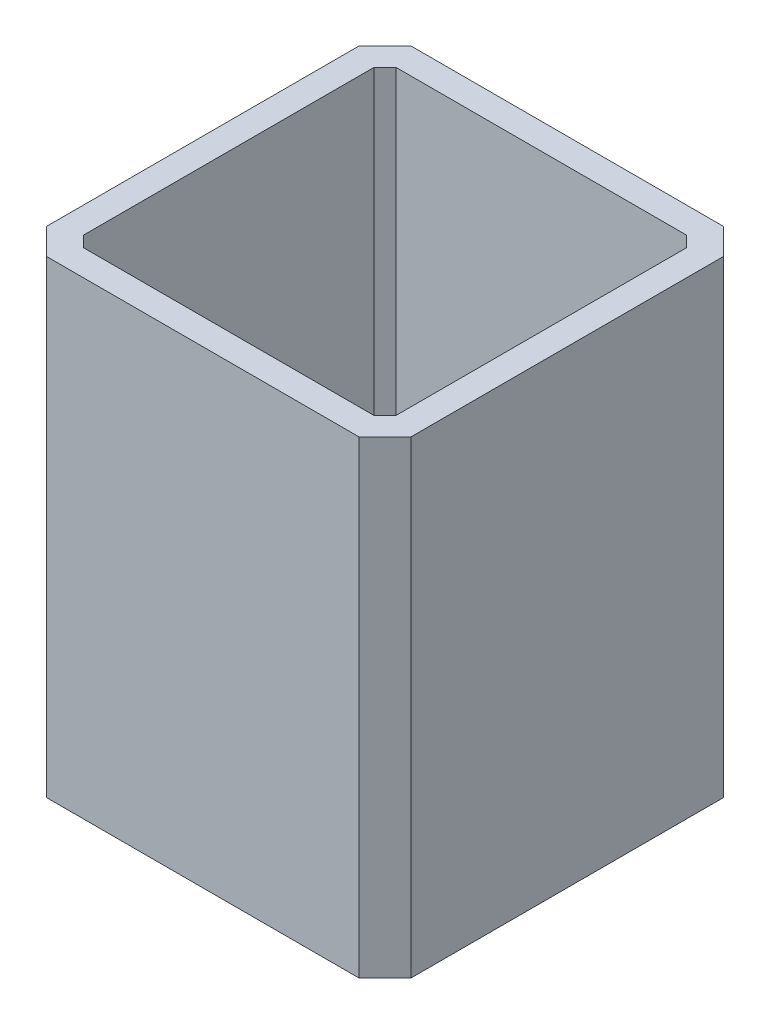
ISO-10303-21;
HEADER;
FILE_DESCRIPTION(('STEP AP214'),'2;1');
FILE_NAME('part.step','',(''),(''),'','','');
FILE_SCHEMA(('AUTOMOTIVE_DESIGN { 1 0 10303 214 1 1 1 1 }'));
ENDSEC;
DATA;
#1=APPLICATION_CONTEXT('core data for automotive mechanical design processes');
#2=APPLICATION_PROTOCOL_DEFINITION('international standard','automotive_design',2000,#1);
#3=PRODUCT_CONTEXT('',#1,'mechanical');
#4=PRODUCT('Part','Part','',(#3));
#5=PRODUCT_RELATED_PRODUCT_CATEGORY('part','',(#4));
#6=PRODUCT_DEFINITION_FORMATION('','',#4);
#7=PRODUCT_DEFINITION_CONTEXT('part definition',#1,'design');
#8=PRODUCT_DEFINITION('design','',#6,#7);
#9=PRODUCT_DEFINITION_SHAPE('','',#8);
#10=(LENGTH_UNIT() NAMED_UNIT(*) SI_UNIT(.MILLI.,.METRE.));
#11=(NAMED_UNIT(*) PLANE_ANGLE_UNIT() SI_UNIT($,.RADIAN.));
#12=(NAMED_UNIT(*) SI_UNIT($,.STERADIAN.) SOLID_ANGLE_UNIT());
#13=UNCERTAINTY_MEASURE_WITH_UNIT(LENGTH_MEASURE(1.E-05),#10,'distance_accuracy_value','');
#14=(GEOMETRIC_REPRESENTATION_CONTEXT(3) GLOBAL_UNCERTAINTY_ASSIGNED_CONTEXT((#13)) GLOBAL_UNIT_ASSIGNED_CONTEXT((#10,
#11,#12)) REPRESENTATION_CONTEXT('',''));
#15=CARTESIAN_POINT('',(0.,0.,0.));
#16=DIRECTION('',(0.,0.,1.));
#17=DIRECTION('',(1.,0.,0.));
#18=AXIS2_PLACEMENT_3D('',#15,#16,#17);
#19=CARTESIAN_POINT('',(1.,18.,-14.));
#20=DIRECTION('',(0.,0.,1.));
#21=DIRECTION('',(1.,0.,0.));
#22=AXIS2_PLACEMENT_3D('',#19,#20,#21);
#23=PLANE('',#22);
#24=DIRECTION('',(-1.,0.,0.));
#25=VECTOR('',#24,1.);
#26=CARTESIAN_POINT('',(1.,0.,-14.));
#27=LINE('',#26,#25);
#28=CARTESIAN_POINT('',(13.,0.,-14.));
#29=VERTEX_POINT('',#28);
#30=CARTESIAN_POINT('',(1.,0.,-14.));
#31=VERTEX_POINT('',#30);
#32=EDGE_CURVE('E142',#29,#31,#27,.T.);
#33=ORIENTED_EDGE('',*,*,#32,.T.);
#34=DIRECTION('',(0.,-1.,0.));
#35=VECTOR('',#34,1.);
#36=CARTESIAN_POINT('',(1.,18.,-14.));
#37=LINE('',#36,#35);
#38=CARTESIAN_POINT('',(1.,18.,-14.));
#39=VERTEX_POINT('',#38);
#40=EDGE_CURVE('E11',#39,#31,#37,.T.);
#41=ORIENTED_EDGE('',*,*,#40,.F.);
#42=DIRECTION('',(-1.,0.,0.));
#43=VECTOR('',#42,1.);
#44=CARTESIAN_POINT('',(1.,18.,-14.));
#45=LINE('',#44,#43);
#46=CARTESIAN_POINT('',(13.,18.,-14.));
#47=VERTEX_POINT('',#46);
#48=EDGE_CURVE('E158',#47,#39,#45,.T.);
#49=ORIENTED_EDGE('',*,*,#48,.F.);
#50=DIRECTION('',(0.,-1.,0.));
#51=VECTOR('',#50,1.);
#52=CARTESIAN_POINT('',(13.,18.,-14.));
#53=LINE('',#52,#51);
#54=EDGE_CURVE('E138',#47,#29,#53,.T.);
#55=ORIENTED_EDGE('',*,*,#54,.T.);
#56=EDGE_LOOP('',(#33,#41,#49,#55));
#57=FACE_BOUND('',#56,.T.);
#58=ADVANCED_FACE('F35',(#57),#23,.F.);
#59=CARTESIAN_POINT('',(0.,18.,-13.));
#60=DIRECTION('',(0.707106781186547,0.,0.707106781186548));
#61=DIRECTION('',(0.707106781186548,0.,-0.707106781186547));
#62=AXIS2_PLACEMENT_3D('',#59,#60,#61);
#63=PLANE('',#62);
#64=DIRECTION('',(-0.707106781186548,0.,0.707106781186547));
#65=VECTOR('',#64,1.);
#66=CARTESIAN_POINT('',(0.,0.,-13.));
#67=LINE('',#66,#65);
#68=CARTESIAN_POINT('',(0.,0.,-13.));
#69=VERTEX_POINT('',#68);
#70=EDGE_CURVE('E145',#31,#69,#67,.T.);
#71=ORIENTED_EDGE('',*,*,#70,.T.);
#72=DIRECTION('',(0.,-1.,0.));
#73=VECTOR('',#72,1.);
#74=CARTESIAN_POINT('',(0.,18.,-13.));
#75=LINE('',#74,#73);
#76=CARTESIAN_POINT('',(0.,18.,-13.));
#77=VERTEX_POINT('',#76);
#78=EDGE_CURVE('E42',#77,#69,#75,.T.);
#79=ORIENTED_EDGE('',*,*,#78,.F.);
#80=DIRECTION('',(-0.707106781186548,0.,0.707106781186547));
#81=VECTOR('',#80,1.);
#82=CARTESIAN_POINT('',(0.,18.,-13.));
#83=LINE('',#82,#81);
#84=EDGE_CURVE('E99',#39,#77,#83,.T.);
#85=ORIENTED_EDGE('',*,*,#84,.F.);
#86=ORIENTED_EDGE('',*,*,#40,.T.);
#87=EDGE_LOOP('',(#71,#79,#85,#86));
#88=FACE_BOUND('',#87,.T.);
#89=ADVANCED_FACE('F327',(#88),#63,.F.);
#90=CARTESIAN_POINT('',(0.,18.,-1.));
#91=DIRECTION('',(1.,0.,0.));
#92=DIRECTION('',(0.,0.,-1.));
#93=AXIS2_PLACEMENT_3D('',#90,#91,#92);
#94=PLANE('',#93);
#95=DIRECTION('',(0.,0.,1.));
#96=VECTOR('',#95,1.);
#97=CARTESIAN_POINT('',(0.,0.,-1.));
#98=LINE('',#97,#96);
#99=CARTESIAN_POINT('',(0.,0.,-1.));
#100=VERTEX_POINT('',#99);
#101=EDGE_CURVE('E148',#69,#100,#98,.T.);
#102=ORIENTED_EDGE('',*,*,#101,.T.);
#103=DIRECTION('',(0.,-1.,0.));
#104=VECTOR('',#103,1.);
#105=CARTESIAN_POINT('',(0.,18.,-1.));
#106=LINE('',#105,#104);
#107=CARTESIAN_POINT('',(0.,18.,-1.));
#108=VERTEX_POINT('',#107);
#109=EDGE_CURVE('E165',#108,#100,#106,.T.);
#110=ORIENTED_EDGE('',*,*,#109,.F.);
#111=DIRECTION('',(0.,0.,1.));
#112=VECTOR('',#111,1.);
#113=CARTESIAN_POINT('',(0.,18.,-1.));
#114=LINE('',#113,#112);
#115=EDGE_CURVE('E173',#77,#108,#114,.T.);
#116=ORIENTED_EDGE('',*,*,#115,.F.);
#117=ORIENTED_EDGE('',*,*,#78,.T.);
#118=EDGE_LOOP('',(#102,#110,#116,#117));
#119=FACE_BOUND('',#118,.T.);
#120=ADVANCED_FACE('F171',(#119),#94,.F.);
#121=CARTESIAN_POINT('',(1.,18.,0.));
#122=DIRECTION('',(0.707106781186547,0.,-0.707106781186547));
#123=DIRECTION('',(-0.707106781186548,0.,-0.707106781186548));
#124=AXIS2_PLACEMENT_3D('',#121,#122,#123);
#125=PLANE('',#124);
#126=DIRECTION('',(0.707106781186548,0.,0.707106781186548));
#127=VECTOR('',#126,1.);
#128=CARTESIAN_POINT('',(1.,0.,0.));
#129=LINE('',#128,#127);
#130=CARTESIAN_POINT('',(1.,0.,0.));
#131=VERTEX_POINT('',#130);
#132=EDGE_CURVE('E150',#100,#131,#129,.T.);
#133=ORIENTED_EDGE('',*,*,#132,.T.);
#134=DIRECTION('',(0.,-1.,0.));
#135=VECTOR('',#134,1.);
#136=CARTESIAN_POINT('',(1.,18.,0.));
#137=LINE('',#136,#135);
#138=CARTESIAN_POINT('',(1.,18.,0.));
#139=VERTEX_POINT('',#138);
#140=EDGE_CURVE('E162',#139,#131,#137,.T.);
#141=ORIENTED_EDGE('',*,*,#140,.F.);
#142=DIRECTION('',(0.707106781186548,0.,0.707106781186548));
#143=VECTOR('',#142,1.);
#144=CARTESIAN_POINT('',(1.,18.,0.));
#145=LINE('',#144,#143);
#146=EDGE_CURVE('E185',#108,#139,#145,.T.);
#147=ORIENTED_EDGE('',*,*,#146,.F.);
#148=ORIENTED_EDGE('',*,*,#109,.T.);
#149=EDGE_LOOP('',(#133,#141,#147,#148));
#150=FACE_BOUND('',#149,.T.);
#151=ADVANCED_FACE('F181',(#150),#125,.F.);
#152=CARTESIAN_POINT('',(1.,18.,0.));
#153=DIRECTION('',(0.,0.,-1.));
#154=DIRECTION('',(-1.,0.,0.));
#155=AXIS2_PLACEMENT_3D('',#152,#153,#154);
#156=PLANE('',#155);
#157=DIRECTION('',(1.,0.,0.));
#158=VECTOR('',#157,1.);
#159=CARTESIAN_POINT('',(1.,0.,0.));
#160=LINE('',#159,#158);
#161=CARTESIAN_POINT('',(13.,0.,0.));
#162=VERTEX_POINT('',#161);
#163=EDGE_CURVE('E152',#131,#162,#160,.T.);
#164=ORIENTED_EDGE('',*,*,#163,.T.);
#165=DIRECTION('',(0.,-1.,0.));
#166=VECTOR('',#165,1.);
#167=CARTESIAN_POINT('',(13.,18.,0.));
#168=LINE('',#167,#166);
#169=CARTESIAN_POINT('',(13.,18.,0.));
#170=VERTEX_POINT('',#169);
#171=EDGE_CURVE('E133',#170,#162,#168,.T.);
#172=ORIENTED_EDGE('',*,*,#171,.F.);
#173=DIRECTION('',(1.,0.,0.));
#174=VECTOR('',#173,1.);
#175=CARTESIAN_POINT('',(1.,18.,0.));
#176=LINE('',#175,#174);
#177=EDGE_CURVE('E121',#139,#170,#176,.T.);
#178=ORIENTED_EDGE('',*,*,#177,.F.);
#179=ORIENTED_EDGE('',*,*,#140,.T.);
#180=EDGE_LOOP('',(#164,#172,#178,#179));
#181=FACE_BOUND('',#180,.T.);
#182=ADVANCED_FACE('F184',(#181),#156,.F.);
#183=CARTESIAN_POINT('',(13.,18.,0.));
#184=DIRECTION('',(-0.707106781186548,0.,-0.707106781186547));
#185=DIRECTION('',(-0.707106781186547,0.,0.707106781186548));
#186=AXIS2_PLACEMENT_3D('',#183,#184,#185);
#187=PLANE('',#186);
#188=DIRECTION('',(0.707106781186547,0.,-0.707106781186548));
#189=VECTOR('',#188,1.);
#190=CARTESIAN_POINT('',(13.,0.,0.));
#191=LINE('',#190,#189);
#192=CARTESIAN_POINT('',(14.,0.,-1.));
#193=VERTEX_POINT('',#192);
#194=EDGE_CURVE('E130',#162,#193,#191,.T.);
#195=ORIENTED_EDGE('',*,*,#194,.T.);
#196=DIRECTION('',(0.,-1.,0.));
#197=VECTOR('',#196,1.);
#198=CARTESIAN_POINT('',(14.,18.,-1.));
#199=LINE('',#198,#197);
#200=CARTESIAN_POINT('',(14.,18.,-1.));
#201=VERTEX_POINT('',#200);
#202=EDGE_CURVE('E127',#201,#193,#199,.T.);
#203=ORIENTED_EDGE('',*,*,#202,.F.);
#204=DIRECTION('',(0.707106781186547,0.,-0.707106781186548));
#205=VECTOR('',#204,1.);
#206=CARTESIAN_POINT('',(13.,18.,0.));
#207=LINE('',#206,#205);
#208=EDGE_CURVE('E114',#170,#201,#207,.T.);
#209=ORIENTED_EDGE('',*,*,#208,.F.);
#210=ORIENTED_EDGE('',*,*,#171,.T.);
#211=EDGE_LOOP('',(#195,#203,#209,#210));
#212=FACE_BOUND('',#211,.T.);
#213=ADVANCED_FACE('F128',(#212),#187,.F.);
#214=CARTESIAN_POINT('',(14.,18.,-1.));
#215=DIRECTION('',(-1.,0.,0.));
#216=DIRECTION('',(0.,0.,1.));
#217=AXIS2_PLACEMENT_3D('',#214,#215,#216);
#218=PLANE('',#217);
#219=DIRECTION('',(0.,0.,-1.));
#220=VECTOR('',#219,1.);
#221=CARTESIAN_POINT('',(14.,0.,-1.));
#222=LINE('',#221,#220);
#223=CARTESIAN_POINT('',(14.,0.,-13.));
#224=VERTEX_POINT('',#223);
#225=EDGE_CURVE('E155',#193,#224,#222,.T.);
#226=ORIENTED_EDGE('',*,*,#225,.T.);
#227=DIRECTION('',(0.,-1.,0.));
#228=VECTOR('',#227,1.);
#229=CARTESIAN_POINT('',(14.,18.,-13.));
#230=LINE('',#229,#228);
#231=CARTESIAN_POINT('',(14.,18.,-13.));
#232=VERTEX_POINT('',#231);
#233=EDGE_CURVE('E134',#232,#224,#230,.T.);
#234=ORIENTED_EDGE('',*,*,#233,.F.);
#235=DIRECTION('',(0.,0.,-1.));
#236=VECTOR('',#235,1.);
#237=CARTESIAN_POINT('',(14.,18.,-1.));
#238=LINE('',#237,#236);
#239=EDGE_CURVE('E118',#201,#232,#238,.T.);
#240=ORIENTED_EDGE('',*,*,#239,.F.);
#241=ORIENTED_EDGE('',*,*,#202,.T.);
#242=EDGE_LOOP('',(#226,#234,#240,#241));
#243=FACE_BOUND('',#242,.T.);
#244=ADVANCED_FACE('F136',(#243),#218,.F.);
#245=CARTESIAN_POINT('',(13.,18.,-14.));
#246=DIRECTION('',(-0.707106781186547,0.,0.707106781186548));
#247=DIRECTION('',(0.707106781186548,0.,0.707106781186547));
#248=AXIS2_PLACEMENT_3D('',#245,#246,#247);
#249=PLANE('',#248);
#250=DIRECTION('',(-0.707106781186548,0.,-0.707106781186547));
#251=VECTOR('',#250,1.);
#252=CARTESIAN_POINT('',(13.,0.,-14.));
#253=LINE('',#252,#251);
#254=EDGE_CURVE('E91',#224,#29,#253,.T.);
#255=ORIENTED_EDGE('',*,*,#254,.T.);
#256=ORIENTED_EDGE('',*,*,#54,.F.);
#257=DIRECTION('',(-0.707106781186548,0.,-0.707106781186547));
#258=VECTOR('',#257,1.);
#259=CARTESIAN_POINT('',(13.,18.,-14.));
#260=LINE('',#259,#258);
#261=EDGE_CURVE('E58',#232,#47,#260,.T.);
#262=ORIENTED_EDGE('',*,*,#261,.F.);
#263=ORIENTED_EDGE('',*,*,#233,.T.);
#264=EDGE_LOOP('',(#255,#256,#262,#263));
#265=FACE_BOUND('',#264,.T.);
#266=ADVANCED_FACE('F334',(#265),#249,.F.);
#267=CARTESIAN_POINT('',(0.,18.,0.));
#268=DIRECTION('',(0.,1.,0.));
#269=DIRECTION('',(0.,0.,1.));
#270=AXIS2_PLACEMENT_3D('',#267,#268,#269);
#271=PLANE('',#270);
#272=DIRECTION('',(-1.,0.,0.));
#273=VECTOR('',#272,1.);
#274=CARTESIAN_POINT('',(1.,18.,-13.));
#275=LINE('',#274,#273);
#276=CARTESIAN_POINT('',(12.5857864376269,18.,-13.));
#277=VERTEX_POINT('',#276);
#278=CARTESIAN_POINT('',(1.4142135623731,18.,-13.));
#279=VERTEX_POINT('',#278);
#280=EDGE_CURVE('E211',#277,#279,#275,.T.);
#281=ORIENTED_EDGE('',*,*,#280,.F.);
#282=DIRECTION('',(-0.707106781186548,0.,-0.707106781186547));
#283=VECTOR('',#282,1.);
#284=CARTESIAN_POINT('',(12.2928932188135,18.,-13.2928932188135));
#285=LINE('',#284,#283);
#286=CARTESIAN_POINT('',(13.,18.,-12.5857864376269));
#287=VERTEX_POINT('',#286);
#288=EDGE_CURVE('E191',#287,#277,#285,.T.);
#289=ORIENTED_EDGE('',*,*,#288,.F.);
#290=DIRECTION('',(0.,0.,-1.));
#291=VECTOR('',#290,1.);
#292=CARTESIAN_POINT('',(13.,18.,-1.));
#293=LINE('',#292,#291);
#294=CARTESIAN_POINT('',(13.,18.,-1.4142135623731));
#295=VERTEX_POINT('',#294);
#296=EDGE_CURVE('E194',#295,#287,#293,.T.);
#297=ORIENTED_EDGE('',*,*,#296,.F.);
#298=DIRECTION('',(0.707106781186547,0.,-0.707106781186548));
#299=VECTOR('',#298,1.);
#300=CARTESIAN_POINT('',(12.2928932188135,18.,-0.707106781186547));
#301=LINE('',#300,#299);
#302=CARTESIAN_POINT('',(12.5857864376269,18.,-1.));
#303=VERTEX_POINT('',#302);
#304=EDGE_CURVE('E196',#303,#295,#301,.T.);
#305=ORIENTED_EDGE('',*,*,#304,.F.);
#306=DIRECTION('',(1.,0.,0.));
#307=VECTOR('',#306,1.);
#308=CARTESIAN_POINT('',(1.,18.,-1.));
#309=LINE('',#308,#307);
#310=CARTESIAN_POINT('',(1.4142135623731,18.,-1.));
#311=VERTEX_POINT('',#310);
#312=EDGE_CURVE('E199',#311,#303,#309,.T.);
#313=ORIENTED_EDGE('',*,*,#312,.F.);
#314=DIRECTION('',(0.707106781186548,0.,0.707106781186548));
#315=VECTOR('',#314,1.);
#316=CARTESIAN_POINT('',(1.70710678118655,18.,-0.707106781186547));
#317=LINE('',#316,#315);
#318=CARTESIAN_POINT('',(1.,18.,-1.41421356237309));
#319=VERTEX_POINT('',#318);
#320=EDGE_CURVE('E202',#319,#311,#317,.T.);
#321=ORIENTED_EDGE('',*,*,#320,.F.);
#322=DIRECTION('',(0.,0.,1.));
#323=VECTOR('',#322,1.);
#324=CARTESIAN_POINT('',(1.,18.,-1.));
#325=LINE('',#324,#323);
#326=CARTESIAN_POINT('',(1.,18.,-12.5857864376269));
#327=VERTEX_POINT('',#326);
#328=EDGE_CURVE('E205',#327,#319,#325,.T.);
#329=ORIENTED_EDGE('',*,*,#328,.F.);
#330=DIRECTION('',(-0.707106781186548,0.,0.707106781186547));
#331=VECTOR('',#330,1.);
#332=CARTESIAN_POINT('',(0.707106781186547,18.,-12.2928932188135));
#333=LINE('',#332,#331);
#334=EDGE_CURVE('E208',#279,#327,#333,.T.);
#335=ORIENTED_EDGE('',*,*,#334,.F.);
#336=EDGE_LOOP('',(#281,#289,#297,#305,#313,#321,#329,#335));
#337=FACE_BOUND('',#336,.T.);
#338=ORIENTED_EDGE('',*,*,#48,.T.);
#339=ORIENTED_EDGE('',*,*,#84,.T.);
#340=ORIENTED_EDGE('',*,*,#115,.T.);
#341=ORIENTED_EDGE('',*,*,#146,.T.);
#342=ORIENTED_EDGE('',*,*,#177,.T.);
#343=ORIENTED_EDGE('',*,*,#208,.T.);
#344=ORIENTED_EDGE('',*,*,#239,.T.);
#345=ORIENTED_EDGE('',*,*,#261,.T.);
#346=EDGE_LOOP('',(#338,#339,#340,#341,#342,#343,#344,#345));
#347=FACE_BOUND('',#346,.T.);
#348=ADVANCED_FACE('F116',(#337,#347),#271,.T.);
#349=CARTESIAN_POINT('',(0.,0.,0.));
#350=DIRECTION('',(0.,1.,0.));
#351=DIRECTION('',(0.,0.,1.));
#352=AXIS2_PLACEMENT_3D('',#349,#350,#351);
#353=PLANE('',#352);
#354=ORIENTED_EDGE('',*,*,#32,.F.);
#355=ORIENTED_EDGE('',*,*,#254,.F.);
#356=ORIENTED_EDGE('',*,*,#225,.F.);
#357=ORIENTED_EDGE('',*,*,#194,.F.);
#358=ORIENTED_EDGE('',*,*,#163,.F.);
#359=ORIENTED_EDGE('',*,*,#132,.F.);
#360=ORIENTED_EDGE('',*,*,#101,.F.);
#361=ORIENTED_EDGE('',*,*,#70,.F.);
#362=EDGE_LOOP('',(#354,#355,#356,#357,#358,#359,#360,#361));
#363=FACE_BOUND('',#362,.T.);
#364=ADVANCED_FACE('F177',(#363),#353,.F.);
#365=CARTESIAN_POINT('',(1.,18.,-13.));
#366=DIRECTION('',(0.,0.,1.));
#367=DIRECTION('',(1.,0.,0.));
#368=AXIS2_PLACEMENT_3D('',#365,#366,#367);
#369=PLANE('',#368);
#370=DIRECTION('',(-1.,0.,0.));
#371=VECTOR('',#370,1.);
#372=CARTESIAN_POINT('',(1.,1.,-13.));
#373=LINE('',#372,#371);
#374=CARTESIAN_POINT('',(12.5857864376269,1.,-13.));
#375=VERTEX_POINT('',#374);
#376=CARTESIAN_POINT('',(1.4142135623731,1.,-13.));
#377=VERTEX_POINT('',#376);
#378=EDGE_CURVE('E251',#375,#377,#373,.T.);
#379=ORIENTED_EDGE('',*,*,#378,.F.);
#380=DIRECTION('',(0.,-1.,0.));
#381=VECTOR('',#380,1.);
#382=CARTESIAN_POINT('',(12.5857864376269,18.,-13.));
#383=LINE('',#382,#381);
#384=EDGE_CURVE('E193',#277,#375,#383,.T.);
#385=ORIENTED_EDGE('',*,*,#384,.F.);
#386=ORIENTED_EDGE('',*,*,#280,.T.);
#387=DIRECTION('',(0.,-1.,0.));
#388=VECTOR('',#387,1.);
#389=CARTESIAN_POINT('',(1.4142135623731,18.,-13.));
#390=LINE('',#389,#388);
#391=EDGE_CURVE('E146',#279,#377,#390,.T.);
#392=ORIENTED_EDGE('',*,*,#391,.T.);
#393=EDGE_LOOP('',(#379,#385,#386,#392));
#394=FACE_BOUND('',#393,.T.);
#395=ADVANCED_FACE('F267',(#394),#369,.T.);
#396=CARTESIAN_POINT('',(0.707106781186547,18.,-12.2928932188135));
#397=DIRECTION('',(0.707106781186547,0.,0.707106781186548));
#398=DIRECTION('',(0.707106781186548,0.,-0.707106781186547));
#399=AXIS2_PLACEMENT_3D('',#396,#397,#398);
#400=PLANE('',#399);
#401=DIRECTION('',(-0.707106781186548,0.,0.707106781186547));
#402=VECTOR('',#401,1.);
#403=CARTESIAN_POINT('',(0.707106781186547,1.,-12.2928932188135));
#404=LINE('',#403,#402);
#405=CARTESIAN_POINT('',(1.,1.,-12.5857864376269));
#406=VERTEX_POINT('',#405);
#407=EDGE_CURVE('E246',#377,#406,#404,.T.);
#408=ORIENTED_EDGE('',*,*,#407,.F.);
#409=ORIENTED_EDGE('',*,*,#391,.F.);
#410=ORIENTED_EDGE('',*,*,#334,.T.);
#411=DIRECTION('',(0.,-1.,0.));
#412=VECTOR('',#411,1.);
#413=CARTESIAN_POINT('',(1.,18.,-12.5857864376269));
#414=LINE('',#413,#412);
#415=EDGE_CURVE('E243',#327,#406,#414,.T.);
#416=ORIENTED_EDGE('',*,*,#415,.T.);
#417=EDGE_LOOP('',(#408,#409,#410,#416));
#418=FACE_BOUND('',#417,.T.);
#419=ADVANCED_FACE('F297',(#418),#400,.T.);
#420=CARTESIAN_POINT('',(1.,18.,-1.));
#421=DIRECTION('',(1.,0.,0.));
#422=DIRECTION('',(0.,0.,-1.));
#423=AXIS2_PLACEMENT_3D('',#420,#421,#422);
#424=PLANE('',#423);
#425=DIRECTION('',(0.,0.,1.));
#426=VECTOR('',#425,1.);
#427=CARTESIAN_POINT('',(1.,1.,-1.));
#428=LINE('',#427,#426);
#429=CARTESIAN_POINT('',(1.,1.,-1.41421356237309));
#430=VERTEX_POINT('',#429);
#431=EDGE_CURVE('E240',#406,#430,#428,.T.);
#432=ORIENTED_EDGE('',*,*,#431,.F.);
#433=ORIENTED_EDGE('',*,*,#415,.F.);
#434=ORIENTED_EDGE('',*,*,#328,.T.);
#435=DIRECTION('',(0.,-1.,0.));
#436=VECTOR('',#435,1.);
#437=CARTESIAN_POINT('',(1.,18.,-1.4142135623731));
#438=LINE('',#437,#436);
#439=EDGE_CURVE('E237',#319,#430,#438,.T.);
#440=ORIENTED_EDGE('',*,*,#439,.T.);
#441=EDGE_LOOP('',(#432,#433,#434,#440));
#442=FACE_BOUND('',#441,.T.);
#443=ADVANCED_FACE('F303',(#442),#424,.T.);
#444=CARTESIAN_POINT('',(1.70710678118655,18.,-0.707106781186547));
#445=DIRECTION('',(0.707106781186547,0.,-0.707106781186547));
#446=DIRECTION('',(-0.707106781186548,0.,-0.707106781186548));
#447=AXIS2_PLACEMENT_3D('',#444,#445,#446);
#448=PLANE('',#447);
#449=DIRECTION('',(0.707106781186548,0.,0.707106781186548));
#450=VECTOR('',#449,1.);
#451=CARTESIAN_POINT('',(1.70710678118655,1.,-0.707106781186547));
#452=LINE('',#451,#450);
#453=CARTESIAN_POINT('',(1.4142135623731,1.,-1.));
#454=VERTEX_POINT('',#453);
#455=EDGE_CURVE('E234',#430,#454,#452,.T.);
#456=ORIENTED_EDGE('',*,*,#455,.F.);
#457=ORIENTED_EDGE('',*,*,#439,.F.);
#458=ORIENTED_EDGE('',*,*,#320,.T.);
#459=DIRECTION('',(0.,-1.,0.));
#460=VECTOR('',#459,1.);
#461=CARTESIAN_POINT('',(1.4142135623731,18.,-1.));
#462=LINE('',#461,#460);
#463=EDGE_CURVE('E231',#311,#454,#462,.T.);
#464=ORIENTED_EDGE('',*,*,#463,.T.);
#465=EDGE_LOOP('',(#456,#457,#458,#464));
#466=FACE_BOUND('',#465,.T.);
#467=ADVANCED_FACE('F425',(#466),#448,.T.);
#468=CARTESIAN_POINT('',(1.,18.,-1.));
#469=DIRECTION('',(0.,0.,-1.));
#470=DIRECTION('',(-1.,0.,0.));
#471=AXIS2_PLACEMENT_3D('',#468,#469,#470);
#472=PLANE('',#471);
#473=DIRECTION('',(1.,0.,0.));
#474=VECTOR('',#473,1.);
#475=CARTESIAN_POINT('',(1.,1.,-1.));
#476=LINE('',#475,#474);
#477=CARTESIAN_POINT('',(12.5857864376269,1.,-1.));
#478=VERTEX_POINT('',#477);
#479=EDGE_CURVE('E228',#454,#478,#476,.T.);
#480=ORIENTED_EDGE('',*,*,#479,.F.);
#481=ORIENTED_EDGE('',*,*,#463,.F.);
#482=ORIENTED_EDGE('',*,*,#312,.T.);
#483=DIRECTION('',(0.,-1.,0.));
#484=VECTOR('',#483,1.);
#485=CARTESIAN_POINT('',(12.5857864376269,18.,-1.));
#486=LINE('',#485,#484);
#487=EDGE_CURVE('E225',#303,#478,#486,.T.);
#488=ORIENTED_EDGE('',*,*,#487,.T.);
#489=EDGE_LOOP('',(#480,#481,#482,#488));
#490=FACE_BOUND('',#489,.T.);
#491=ADVANCED_FACE('F324',(#490),#472,.T.);
#492=CARTESIAN_POINT('',(12.2928932188135,18.,-0.707106781186547));
#493=DIRECTION('',(-0.707106781186548,0.,-0.707106781186547));
#494=DIRECTION('',(-0.707106781186547,0.,0.707106781186548));
#495=AXIS2_PLACEMENT_3D('',#492,#493,#494);
#496=PLANE('',#495);
#497=DIRECTION('',(0.707106781186547,0.,-0.707106781186548));
#498=VECTOR('',#497,1.);
#499=CARTESIAN_POINT('',(12.2928932188135,1.,-0.707106781186547));
#500=LINE('',#499,#498);
#501=CARTESIAN_POINT('',(13.,1.,-1.4142135623731));
#502=VERTEX_POINT('',#501);
#503=EDGE_CURVE('E222',#478,#502,#500,.T.);
#504=ORIENTED_EDGE('',*,*,#503,.F.);
#505=ORIENTED_EDGE('',*,*,#487,.F.);
#506=ORIENTED_EDGE('',*,*,#304,.T.);
#507=DIRECTION('',(0.,-1.,0.));
#508=VECTOR('',#507,1.);
#509=CARTESIAN_POINT('',(13.,18.,-1.4142135623731));
#510=LINE('',#509,#508);
#511=EDGE_CURVE('E219',#295,#502,#510,.T.);
#512=ORIENTED_EDGE('',*,*,#511,.T.);
#513=EDGE_LOOP('',(#504,#505,#506,#512));
#514=FACE_BOUND('',#513,.T.);
#515=ADVANCED_FACE('F314',(#514),#496,.T.);
#516=CARTESIAN_POINT('',(13.,18.,-1.));
#517=DIRECTION('',(-1.,0.,0.));
#518=DIRECTION('',(0.,0.,1.));
#519=AXIS2_PLACEMENT_3D('',#516,#517,#518);
#520=PLANE('',#519);
#521=DIRECTION('',(0.,0.,-1.));
#522=VECTOR('',#521,1.);
#523=CARTESIAN_POINT('',(13.,1.,-1.));
#524=LINE('',#523,#522);
#525=CARTESIAN_POINT('',(13.,1.,-12.5857864376269));
#526=VERTEX_POINT('',#525);
#527=EDGE_CURVE('E217',#502,#526,#524,.T.);
#528=ORIENTED_EDGE('',*,*,#527,.F.);
#529=ORIENTED_EDGE('',*,*,#511,.F.);
#530=ORIENTED_EDGE('',*,*,#296,.T.);
#531=DIRECTION('',(0.,-1.,0.));
#532=VECTOR('',#531,1.);
#533=CARTESIAN_POINT('',(13.,18.,-12.5857864376269));
#534=LINE('',#533,#532);
#535=EDGE_CURVE('E49',#287,#526,#534,.T.);
#536=ORIENTED_EDGE('',*,*,#535,.T.);
#537=EDGE_LOOP('',(#528,#529,#530,#536));
#538=FACE_BOUND('',#537,.T.);
#539=ADVANCED_FACE('F316',(#538),#520,.T.);
#540=CARTESIAN_POINT('',(12.2928932188135,18.,-13.2928932188135));
#541=DIRECTION('',(-0.707106781186547,0.,0.707106781186548));
#542=DIRECTION('',(0.707106781186548,0.,0.707106781186547));
#543=AXIS2_PLACEMENT_3D('',#540,#541,#542);
#544=PLANE('',#543);
#545=DIRECTION('',(-0.707106781186548,0.,-0.707106781186547));
#546=VECTOR('',#545,1.);
#547=CARTESIAN_POINT('',(12.2928932188135,1.,-13.2928932188135));
#548=LINE('',#547,#546);
#549=EDGE_CURVE('E214',#526,#375,#548,.T.);
#550=ORIENTED_EDGE('',*,*,#549,.F.);
#551=ORIENTED_EDGE('',*,*,#535,.F.);
#552=ORIENTED_EDGE('',*,*,#288,.T.);
#553=ORIENTED_EDGE('',*,*,#384,.T.);
#554=EDGE_LOOP('',(#550,#551,#552,#553));
#555=FACE_BOUND('',#554,.T.);
#556=ADVANCED_FACE('F291',(#555),#544,.T.);
#557=CARTESIAN_POINT('',(0.,1.,0.));
#558=DIRECTION('',(0.,1.,0.));
#559=DIRECTION('',(0.,0.,1.));
#560=AXIS2_PLACEMENT_3D('',#557,#558,#559);
#561=PLANE('',#560);
#562=ORIENTED_EDGE('',*,*,#378,.T.);
#563=ORIENTED_EDGE('',*,*,#407,.T.);
#564=ORIENTED_EDGE('',*,*,#431,.T.);
#565=ORIENTED_EDGE('',*,*,#455,.T.);
#566=ORIENTED_EDGE('',*,*,#479,.T.);
#567=ORIENTED_EDGE('',*,*,#503,.T.);
#568=ORIENTED_EDGE('',*,*,#527,.T.);
#569=ORIENTED_EDGE('',*,*,#549,.T.);
#570=EDGE_LOOP('',(#562,#563,#564,#565,#566,#567,#568,#569));
#571=FACE_BOUND('',#570,.T.);
#572=ADVANCED_FACE('F260',(#571),#561,.T.);
#573=CLOSED_SHELL('',(#58,#89,#120,#151,#182,#213,#244,#266,#348,#364,#395,#419,#443,#467,#491,
#515,#539,#556,#572));
#574=MANIFOLD_SOLID_BREP('B2',#573);
#575=ADVANCED_BREP_SHAPE_REPRESENTATION('',(#18,#574),#14);
#576=SHAPE_DEFINITION_REPRESENTATION(#9,#575);
ENDSEC;
END-ISO-10303-21;
